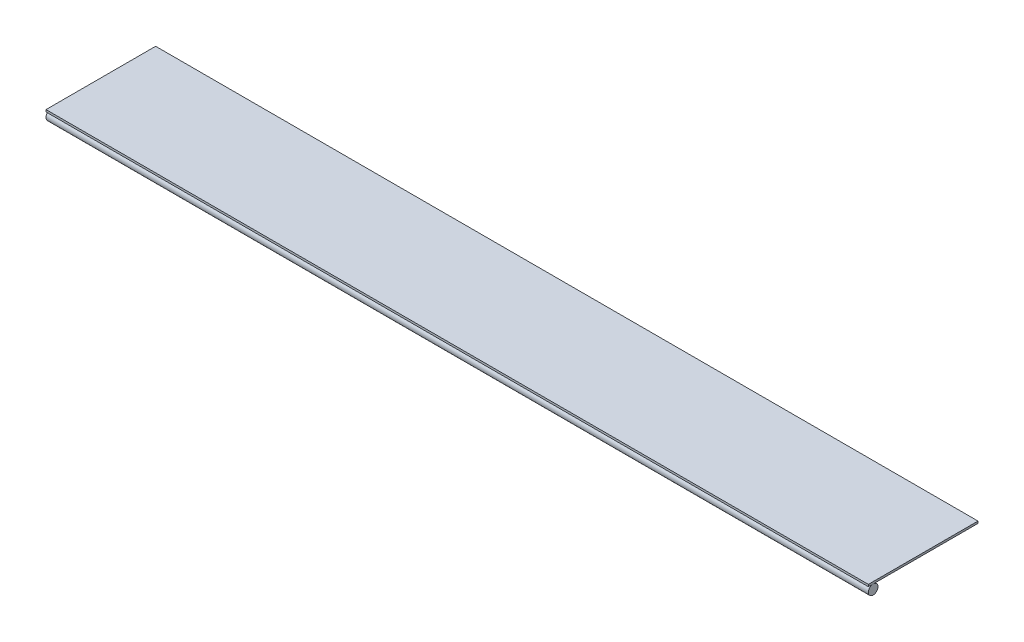
ISO-10303-21;
HEADER;
FILE_DESCRIPTION(('STEP AP214'),'2;1');
FILE_NAME('part.step','',(''),(''),'','','');
FILE_SCHEMA(('AUTOMOTIVE_DESIGN { 1 0 10303 214 1 1 1 1 }'));
ENDSEC;
DATA;
#1=APPLICATION_CONTEXT('core data for automotive mechanical design processes');
#2=APPLICATION_PROTOCOL_DEFINITION('international standard','automotive_design',2000,#1);
#3=PRODUCT_CONTEXT('',#1,'mechanical');
#4=PRODUCT('Part','Part','',(#3));
#5=PRODUCT_RELATED_PRODUCT_CATEGORY('part','',(#4));
#6=PRODUCT_DEFINITION_FORMATION('','',#4);
#7=PRODUCT_DEFINITION_CONTEXT('part definition',#1,'design');
#8=PRODUCT_DEFINITION('design','',#6,#7);
#9=PRODUCT_DEFINITION_SHAPE('','',#8);
#10=(LENGTH_UNIT() NAMED_UNIT(*) SI_UNIT(.MILLI.,.METRE.));
#11=(NAMED_UNIT(*) PLANE_ANGLE_UNIT() SI_UNIT($,.RADIAN.));
#12=(NAMED_UNIT(*) SI_UNIT($,.STERADIAN.) SOLID_ANGLE_UNIT());
#13=UNCERTAINTY_MEASURE_WITH_UNIT(LENGTH_MEASURE(1.E-05),#10,'distance_accuracy_value','');
#14=(GEOMETRIC_REPRESENTATION_CONTEXT(3) GLOBAL_UNCERTAINTY_ASSIGNED_CONTEXT((#13)) GLOBAL_UNIT_ASSIGNED_CONTEXT((#10,
#11,#12)) REPRESENTATION_CONTEXT('',''));
#15=CARTESIAN_POINT('',(0.,0.,0.));
#16=DIRECTION('',(0.,0.,1.));
#17=DIRECTION('',(1.,0.,0.));
#18=AXIS2_PLACEMENT_3D('',#15,#16,#17);
#19=CARTESIAN_POINT('',(-150.,-1.76,18.24));
#20=DIRECTION('',(1.,0.,0.));
#21=DIRECTION('',(0.,0.,-1.));
#22=AXIS2_PLACEMENT_3D('',#19,#20,#21);
#23=CYLINDRICAL_SURFACE('',#22,1.76);
#24=CARTESIAN_POINT('',(-150.,-1.76,18.24));
#25=DIRECTION('',(1.,0.,0.));
#26=DIRECTION('',(0.,0.,-1.));
#27=AXIS2_PLACEMENT_3D('',#24,#25,#26);
#28=CIRCLE('',#27,1.76);
#29=CARTESIAN_POINT('',(-150.,-1.76,16.48));
#30=VERTEX_POINT('',#29);
#31=EDGE_CURVE('E11',#30,#30,#28,.T.);
#32=ORIENTED_EDGE('',*,*,#31,.T.);
#33=EDGE_LOOP('',(#32));
#34=FACE_BOUND('',#33,.T.);
#35=CARTESIAN_POINT('',(150.,-1.76,18.24));
#36=DIRECTION('',(1.,0.,0.));
#37=DIRECTION('',(0.,0.,-1.));
#38=AXIS2_PLACEMENT_3D('',#35,#36,#37);
#39=CIRCLE('',#38,1.76);
#40=CARTESIAN_POINT('',(150.,-1.76,16.48));
#41=VERTEX_POINT('',#40);
#42=EDGE_CURVE('E47',#41,#41,#39,.T.);
#43=ORIENTED_EDGE('',*,*,#42,.F.);
#44=EDGE_LOOP('',(#43));
#45=FACE_BOUND('',#44,.T.);
#46=ADVANCED_FACE('F44',(#34,#45),#23,.T.);
#47=CARTESIAN_POINT('',(-150.,-1.76,18.24));
#48=DIRECTION('',(1.,0.,0.));
#49=DIRECTION('',(0.,0.,-1.));
#50=AXIS2_PLACEMENT_3D('',#47,#48,#49);
#51=PLANE('',#50);
#52=ORIENTED_EDGE('',*,*,#31,.F.);
#53=EDGE_LOOP('',(#52));
#54=FACE_BOUND('',#53,.T.);
#55=ADVANCED_FACE('F59',(#54),#51,.F.);
#56=CARTESIAN_POINT('',(150.,-1.76,18.24));
#57=DIRECTION('',(1.,0.,0.));
#58=DIRECTION('',(0.,0.,-1.));
#59=AXIS2_PLACEMENT_3D('',#56,#57,#58);
#60=PLANE('',#59);
#61=ORIENTED_EDGE('',*,*,#42,.T.);
#62=EDGE_LOOP('',(#61));
#63=FACE_BOUND('',#62,.T.);
#64=ADVANCED_FACE('F56',(#63),#60,.T.);
#65=CLOSED_SHELL('',(#46,#55,#64));
#66=MANIFOLD_SOLID_BREP('B2',#65);
#67=CARTESIAN_POINT('',(-150.,0.75,20.));
#68=DIRECTION('',(1.,0.,0.));
#69=DIRECTION('',(0.,0.,-1.));
#70=AXIS2_PLACEMENT_3D('',#67,#68,#69);
#71=PLANE('',#70);
#72=DIRECTION('',(0.,0.,1.));
#73=VECTOR('',#72,1.);
#74=CARTESIAN_POINT('',(-150.,0.,20.));
#75=LINE('',#74,#73);
#76=CARTESIAN_POINT('',(-150.,0.,-20.));
#77=VERTEX_POINT('',#76);
#78=CARTESIAN_POINT('',(-150.,0.,20.));
#79=VERTEX_POINT('',#78);
#80=EDGE_CURVE('E148',#77,#79,#75,.T.);
#81=ORIENTED_EDGE('',*,*,#80,.T.);
#82=DIRECTION('',(0.,-1.,0.));
#83=VECTOR('',#82,1.);
#84=CARTESIAN_POINT('',(-150.,0.75,20.));
#85=LINE('',#84,#83);
#86=CARTESIAN_POINT('',(-150.,0.75,20.));
#87=VERTEX_POINT('',#86);
#88=EDGE_CURVE('E42',#87,#79,#85,.T.);
#89=ORIENTED_EDGE('',*,*,#88,.F.);
#90=DIRECTION('',(0.,0.,1.));
#91=VECTOR('',#90,1.);
#92=CARTESIAN_POINT('',(-150.,0.75,20.));
#93=LINE('',#92,#91);
#94=CARTESIAN_POINT('',(-150.,0.75,-20.));
#95=VERTEX_POINT('',#94);
#96=EDGE_CURVE('E135',#95,#87,#93,.T.);
#97=ORIENTED_EDGE('',*,*,#96,.F.);
#98=DIRECTION('',(0.,-1.,0.));
#99=VECTOR('',#98,1.);
#100=CARTESIAN_POINT('',(-150.,0.75,-20.));
#101=LINE('',#100,#99);
#102=EDGE_CURVE('E144',#95,#77,#101,.T.);
#103=ORIENTED_EDGE('',*,*,#102,.T.);
#104=EDGE_LOOP('',(#81,#89,#97,#103));
#105=FACE_BOUND('',#104,.T.);
#106=ADVANCED_FACE('F84',(#105),#71,.F.);
#107=CARTESIAN_POINT('',(150.,0.75,20.));
#108=DIRECTION('',(0.,0.,-1.));
#109=DIRECTION('',(-1.,0.,0.));
#110=AXIS2_PLACEMENT_3D('',#107,#108,#109);
#111=PLANE('',#110);
#112=DIRECTION('',(1.,0.,0.));
#113=VECTOR('',#112,1.);
#114=CARTESIAN_POINT('',(150.,0.,20.));
#115=LINE('',#114,#113);
#116=CARTESIAN_POINT('',(150.,0.,20.));
#117=VERTEX_POINT('',#116);
#118=EDGE_CURVE('E140',#79,#117,#115,.T.);
#119=ORIENTED_EDGE('',*,*,#118,.T.);
#120=DIRECTION('',(0.,-1.,0.));
#121=VECTOR('',#120,1.);
#122=CARTESIAN_POINT('',(150.,0.75,20.));
#123=LINE('',#122,#121);
#124=CARTESIAN_POINT('',(150.,0.75,20.));
#125=VERTEX_POINT('',#124);
#126=EDGE_CURVE('E92',#125,#117,#123,.T.);
#127=ORIENTED_EDGE('',*,*,#126,.F.);
#128=DIRECTION('',(1.,0.,0.));
#129=VECTOR('',#128,1.);
#130=CARTESIAN_POINT('',(150.,0.75,20.));
#131=LINE('',#130,#129);
#132=EDGE_CURVE('E130',#87,#125,#131,.T.);
#133=ORIENTED_EDGE('',*,*,#132,.F.);
#134=ORIENTED_EDGE('',*,*,#88,.T.);
#135=EDGE_LOOP('',(#119,#127,#133,#134));
#136=FACE_BOUND('',#135,.T.);
#137=ADVANCED_FACE('F138',(#136),#111,.F.);
#138=CARTESIAN_POINT('',(150.,0.75,20.));
#139=DIRECTION('',(-1.,0.,0.));
#140=DIRECTION('',(0.,0.,1.));
#141=AXIS2_PLACEMENT_3D('',#138,#139,#140);
#142=PLANE('',#141);
#143=DIRECTION('',(0.,0.,-1.));
#144=VECTOR('',#143,1.);
#145=CARTESIAN_POINT('',(150.,0.,20.));
#146=LINE('',#145,#144);
#147=CARTESIAN_POINT('',(150.,0.,-20.));
#148=VERTEX_POINT('',#147);
#149=EDGE_CURVE('E117',#117,#148,#146,.T.);
#150=ORIENTED_EDGE('',*,*,#149,.T.);
#151=DIRECTION('',(0.,-1.,0.));
#152=VECTOR('',#151,1.);
#153=CARTESIAN_POINT('',(150.,0.75,-20.));
#154=LINE('',#153,#152);
#155=CARTESIAN_POINT('',(150.,0.75,-20.));
#156=VERTEX_POINT('',#155);
#157=EDGE_CURVE('E141',#156,#148,#154,.T.);
#158=ORIENTED_EDGE('',*,*,#157,.F.);
#159=DIRECTION('',(0.,0.,-1.));
#160=VECTOR('',#159,1.);
#161=CARTESIAN_POINT('',(150.,0.75,20.));
#162=LINE('',#161,#160);
#163=EDGE_CURVE('E133',#125,#156,#162,.T.);
#164=ORIENTED_EDGE('',*,*,#163,.F.);
#165=ORIENTED_EDGE('',*,*,#126,.T.);
#166=EDGE_LOOP('',(#150,#158,#164,#165));
#167=FACE_BOUND('',#166,.T.);
#168=ADVANCED_FACE('F142',(#167),#142,.F.);
#169=CARTESIAN_POINT('',(150.,0.75,-20.));
#170=DIRECTION('',(0.,0.,1.));
#171=DIRECTION('',(1.,0.,0.));
#172=AXIS2_PLACEMENT_3D('',#169,#170,#171);
#173=PLANE('',#172);
#174=DIRECTION('',(-1.,0.,0.));
#175=VECTOR('',#174,1.);
#176=CARTESIAN_POINT('',(150.,0.,-20.));
#177=LINE('',#176,#175);
#178=EDGE_CURVE('E123',#148,#77,#177,.T.);
#179=ORIENTED_EDGE('',*,*,#178,.T.);
#180=ORIENTED_EDGE('',*,*,#102,.F.);
#181=DIRECTION('',(-1.,0.,0.));
#182=VECTOR('',#181,1.);
#183=CARTESIAN_POINT('',(150.,0.75,-20.));
#184=LINE('',#183,#182);
#185=EDGE_CURVE('E100',#156,#95,#184,.T.);
#186=ORIENTED_EDGE('',*,*,#185,.F.);
#187=ORIENTED_EDGE('',*,*,#157,.T.);
#188=EDGE_LOOP('',(#179,#180,#186,#187));
#189=FACE_BOUND('',#188,.T.);
#190=ADVANCED_FACE('F154',(#189),#173,.F.);
#191=CARTESIAN_POINT('',(0.,0.75,0.));
#192=DIRECTION('',(0.,1.,0.));
#193=DIRECTION('',(0.,0.,1.));
#194=AXIS2_PLACEMENT_3D('',#191,#192,#193);
#195=PLANE('',#194);
#196=ORIENTED_EDGE('',*,*,#96,.T.);
#197=ORIENTED_EDGE('',*,*,#132,.T.);
#198=ORIENTED_EDGE('',*,*,#163,.T.);
#199=ORIENTED_EDGE('',*,*,#185,.T.);
#200=EDGE_LOOP('',(#196,#197,#198,#199));
#201=FACE_BOUND('',#200,.T.);
#202=ADVANCED_FACE('F131',(#201),#195,.T.);
#203=CARTESIAN_POINT('',(0.,0.,0.));
#204=DIRECTION('',(0.,1.,0.));
#205=DIRECTION('',(0.,0.,1.));
#206=AXIS2_PLACEMENT_3D('',#203,#204,#205);
#207=PLANE('',#206);
#208=ORIENTED_EDGE('',*,*,#118,.F.);
#209=ORIENTED_EDGE('',*,*,#80,.F.);
#210=ORIENTED_EDGE('',*,*,#178,.F.);
#211=ORIENTED_EDGE('',*,*,#149,.F.);
#212=EDGE_LOOP('',(#208,#209,#210,#211));
#213=FACE_BOUND('',#212,.T.);
#214=ADVANCED_FACE('F157',(#213),#207,.F.);
#215=CLOSED_SHELL('',(#106,#137,#168,#190,#202,#214));
#216=MANIFOLD_SOLID_BREP('B6',#215);
#217=ADVANCED_BREP_SHAPE_REPRESENTATION('',(#18,#66,#216),#14);
#218=SHAPE_DEFINITION_REPRESENTATION(#9,#217);
ENDSEC;
END-ISO-10303-21;
